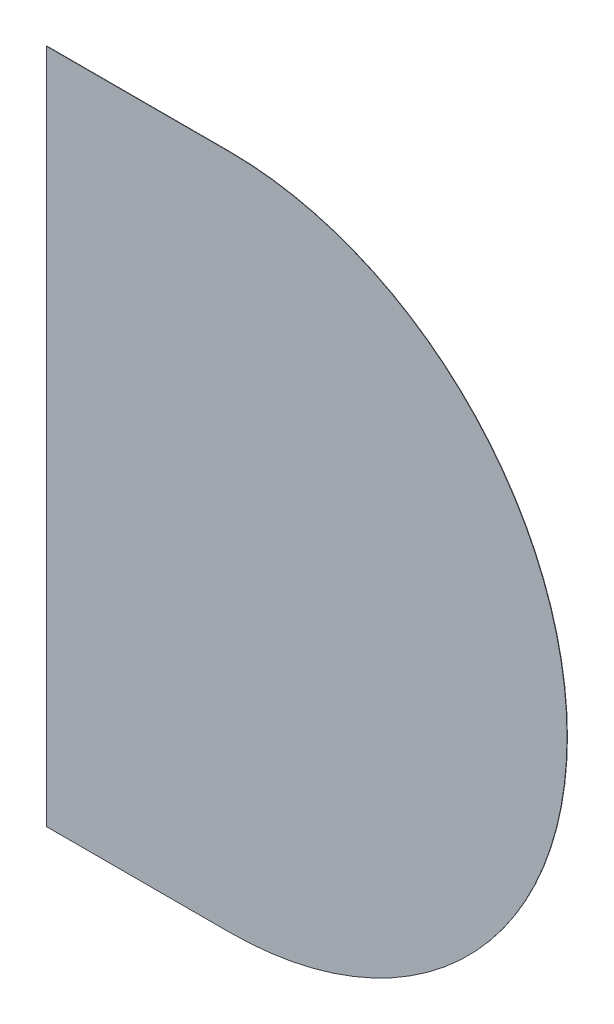
ISO-10303-21;
HEADER;
FILE_DESCRIPTION(('STEP AP214'),'2;1');
FILE_NAME('part.step','',(''),(''),'','','');
FILE_SCHEMA(('AUTOMOTIVE_DESIGN { 1 0 10303 214 1 1 1 1 }'));
ENDSEC;
DATA;
#1=APPLICATION_CONTEXT('core data for automotive mechanical design processes');
#2=APPLICATION_PROTOCOL_DEFINITION('international standard','automotive_design',2000,#1);
#3=PRODUCT_CONTEXT('',#1,'mechanical');
#4=PRODUCT('Part','Part','',(#3));
#5=PRODUCT_RELATED_PRODUCT_CATEGORY('part','',(#4));
#6=PRODUCT_DEFINITION_FORMATION('','',#4);
#7=PRODUCT_DEFINITION_CONTEXT('part definition',#1,'design');
#8=PRODUCT_DEFINITION('design','',#6,#7);
#9=PRODUCT_DEFINITION_SHAPE('','',#8);
#10=(LENGTH_UNIT() NAMED_UNIT(*) SI_UNIT(.MILLI.,.METRE.));
#11=(NAMED_UNIT(*) PLANE_ANGLE_UNIT() SI_UNIT($,.RADIAN.));
#12=(NAMED_UNIT(*) SI_UNIT($,.STERADIAN.) SOLID_ANGLE_UNIT());
#13=UNCERTAINTY_MEASURE_WITH_UNIT(LENGTH_MEASURE(1.E-05),#10,'distance_accuracy_value','');
#14=(GEOMETRIC_REPRESENTATION_CONTEXT(3) GLOBAL_UNCERTAINTY_ASSIGNED_CONTEXT((#13)) GLOBAL_UNIT_ASSIGNED_CONTEXT((#10,
#11,#12)) REPRESENTATION_CONTEXT('',''));
#15=CARTESIAN_POINT('',(0.,0.,0.));
#16=DIRECTION('',(0.,0.,1.));
#17=DIRECTION('',(1.,0.,0.));
#18=AXIS2_PLACEMENT_3D('',#15,#16,#17);
#19=CARTESIAN_POINT('',(0.,0.,1.));
#20=DIRECTION('',(1.,0.,0.));
#21=DIRECTION('',(0.,1.,0.));
#22=AXIS2_PLACEMENT_3D('',#19,#20,#21);
#23=PLANE('',#22);
#24=DIRECTION('',(0.,-1.,0.));
#25=VECTOR('',#24,1.);
#26=CARTESIAN_POINT('',(0.,0.,0.));
#27=LINE('',#26,#25);
#28=CARTESIAN_POINT('',(-3.33066907387547E-13,1740.,0.));
#29=VERTEX_POINT('',#28);
#30=CARTESIAN_POINT('',(0.,0.,0.));
#31=VERTEX_POINT('',#30);
#32=EDGE_CURVE('E97',#29,#31,#27,.T.);
#33=ORIENTED_EDGE('',*,*,#32,.T.);
#34=DIRECTION('',(0.,0.,-1.));
#35=VECTOR('',#34,1.);
#36=CARTESIAN_POINT('',(0.,0.,1.));
#37=LINE('',#36,#35);
#38=CARTESIAN_POINT('',(0.,0.,1.));
#39=VERTEX_POINT('',#38);
#40=EDGE_CURVE('E11',#39,#31,#37,.T.);
#41=ORIENTED_EDGE('',*,*,#40,.F.);
#42=DIRECTION('',(0.,-1.,0.));
#43=VECTOR('',#42,1.);
#44=CARTESIAN_POINT('',(0.,0.,1.));
#45=LINE('',#44,#43);
#46=CARTESIAN_POINT('',(-3.33066907387547E-13,1740.,1.));
#47=VERTEX_POINT('',#46);
#48=EDGE_CURVE('E85',#47,#39,#45,.T.);
#49=ORIENTED_EDGE('',*,*,#48,.F.);
#50=DIRECTION('',(0.,0.,-1.));
#51=VECTOR('',#50,1.);
#52=CARTESIAN_POINT('',(-3.33066907387547E-13,1740.,1.));
#53=LINE('',#52,#51);
#54=EDGE_CURVE('E93',#47,#29,#53,.T.);
#55=ORIENTED_EDGE('',*,*,#54,.T.);
#56=EDGE_LOOP('',(#33,#41,#49,#55));
#57=FACE_BOUND('',#56,.T.);
#58=ADVANCED_FACE('F34',(#57),#23,.F.);
#59=CARTESIAN_POINT('',(0.,0.,1.));
#60=DIRECTION('',(0.,1.,0.));
#61=DIRECTION('',(0.,0.,1.));
#62=AXIS2_PLACEMENT_3D('',#59,#60,#61);
#63=PLANE('',#62);
#64=DIRECTION('',(1.,0.,0.));
#65=VECTOR('',#64,1.);
#66=CARTESIAN_POINT('',(0.,0.,0.));
#67=LINE('',#66,#65);
#68=CARTESIAN_POINT('',(470.,0.,0.));
#69=VERTEX_POINT('',#68);
#70=EDGE_CURVE('E89',#31,#69,#67,.T.);
#71=ORIENTED_EDGE('',*,*,#70,.T.);
#72=DIRECTION('',(0.,0.,-1.));
#73=VECTOR('',#72,1.);
#74=CARTESIAN_POINT('',(470.,0.,1.));
#75=LINE('',#74,#73);
#76=CARTESIAN_POINT('',(470.,0.,1.));
#77=VERTEX_POINT('',#76);
#78=EDGE_CURVE('E42',#77,#69,#75,.T.);
#79=ORIENTED_EDGE('',*,*,#78,.F.);
#80=DIRECTION('',(1.,0.,0.));
#81=VECTOR('',#80,1.);
#82=CARTESIAN_POINT('',(0.,0.,1.));
#83=LINE('',#82,#81);
#84=EDGE_CURVE('E80',#39,#77,#83,.T.);
#85=ORIENTED_EDGE('',*,*,#84,.F.);
#86=ORIENTED_EDGE('',*,*,#40,.T.);
#87=EDGE_LOOP('',(#71,#79,#85,#86));
#88=FACE_BOUND('',#87,.T.);
#89=ADVANCED_FACE('F88',(#88),#63,.F.);
#90=CARTESIAN_POINT('',(470.,870.,1.));
#91=DIRECTION('',(0.,0.,-1.));
#92=DIRECTION('',(-1.,0.,0.));
#93=AXIS2_PLACEMENT_3D('',#90,#91,#92);
#94=CYLINDRICAL_SURFACE('',#93,870.);
#95=CARTESIAN_POINT('',(470.,870.,0.));
#96=DIRECTION('',(0.,0.,1.));
#97=DIRECTION('',(-1.,0.,0.));
#98=AXIS2_PLACEMENT_3D('',#95,#96,#97);
#99=CIRCLE('',#98,870.);
#100=CARTESIAN_POINT('',(470.,1740.,0.));
#101=VERTEX_POINT('',#100);
#102=EDGE_CURVE('E67',#69,#101,#99,.T.);
#103=ORIENTED_EDGE('',*,*,#102,.T.);
#104=DIRECTION('',(0.,0.,-1.));
#105=VECTOR('',#104,1.);
#106=CARTESIAN_POINT('',(470.,1740.,1.));
#107=LINE('',#106,#105);
#108=CARTESIAN_POINT('',(470.,1740.,1.));
#109=VERTEX_POINT('',#108);
#110=EDGE_CURVE('E90',#109,#101,#107,.T.);
#111=ORIENTED_EDGE('',*,*,#110,.F.);
#112=CARTESIAN_POINT('',(470.,870.,1.));
#113=DIRECTION('',(0.,0.,1.));
#114=DIRECTION('',(-1.,0.,0.));
#115=AXIS2_PLACEMENT_3D('',#112,#113,#114);
#116=CIRCLE('',#115,870.);
#117=EDGE_CURVE('E83',#77,#109,#116,.T.);
#118=ORIENTED_EDGE('',*,*,#117,.F.);
#119=ORIENTED_EDGE('',*,*,#78,.T.);
#120=EDGE_LOOP('',(#103,#111,#118,#119));
#121=FACE_BOUND('',#120,.T.);
#122=ADVANCED_FACE('F91',(#121),#94,.T.);
#123=CARTESIAN_POINT('',(-3.33066907387547E-13,1740.,1.));
#124=DIRECTION('',(0.,-1.,0.));
#125=DIRECTION('',(0.,0.,-1.));
#126=AXIS2_PLACEMENT_3D('',#123,#124,#125);
#127=PLANE('',#126);
#128=DIRECTION('',(-1.,0.,0.));
#129=VECTOR('',#128,1.);
#130=CARTESIAN_POINT('',(-3.33066907387547E-13,1740.,0.));
#131=LINE('',#130,#129);
#132=EDGE_CURVE('E73',#101,#29,#131,.T.);
#133=ORIENTED_EDGE('',*,*,#132,.T.);
#134=ORIENTED_EDGE('',*,*,#54,.F.);
#135=DIRECTION('',(-1.,0.,0.));
#136=VECTOR('',#135,1.);
#137=CARTESIAN_POINT('',(-3.33066907387547E-13,1740.,1.));
#138=LINE('',#137,#136);
#139=EDGE_CURVE('E50',#109,#47,#138,.T.);
#140=ORIENTED_EDGE('',*,*,#139,.F.);
#141=ORIENTED_EDGE('',*,*,#110,.T.);
#142=EDGE_LOOP('',(#133,#134,#140,#141));
#143=FACE_BOUND('',#142,.T.);
#144=ADVANCED_FACE('F104',(#143),#127,.F.);
#145=CARTESIAN_POINT('',(470.,870.,1.));
#146=DIRECTION('',(0.,0.,-1.));
#147=DIRECTION('',(-1.,0.,0.));
#148=AXIS2_PLACEMENT_3D('',#145,#146,#147);
#149=PLANE('',#148);
#150=ORIENTED_EDGE('',*,*,#48,.T.);
#151=ORIENTED_EDGE('',*,*,#84,.T.);
#152=ORIENTED_EDGE('',*,*,#117,.T.);
#153=ORIENTED_EDGE('',*,*,#139,.T.);
#154=EDGE_LOOP('',(#150,#151,#152,#153));
#155=FACE_BOUND('',#154,.T.);
#156=ADVANCED_FACE('F81',(#155),#149,.F.);
#157=CARTESIAN_POINT('',(470.,870.,0.));
#158=DIRECTION('',(0.,0.,-1.));
#159=DIRECTION('',(-1.,0.,0.));
#160=AXIS2_PLACEMENT_3D('',#157,#158,#159);
#161=PLANE('',#160);
#162=ORIENTED_EDGE('',*,*,#32,.F.);
#163=ORIENTED_EDGE('',*,*,#132,.F.);
#164=ORIENTED_EDGE('',*,*,#102,.F.);
#165=ORIENTED_EDGE('',*,*,#70,.F.);
#166=EDGE_LOOP('',(#162,#163,#164,#165));
#167=FACE_BOUND('',#166,.T.);
#168=ADVANCED_FACE('F107',(#167),#161,.T.);
#169=CLOSED_SHELL('',(#58,#89,#122,#144,#156,#168));
#170=MANIFOLD_SOLID_BREP('B2',#169);
#171=ADVANCED_BREP_SHAPE_REPRESENTATION('',(#18,#170),#14);
#172=SHAPE_DEFINITION_REPRESENTATION(#9,#171);
ENDSEC;
END-ISO-10303-21;
